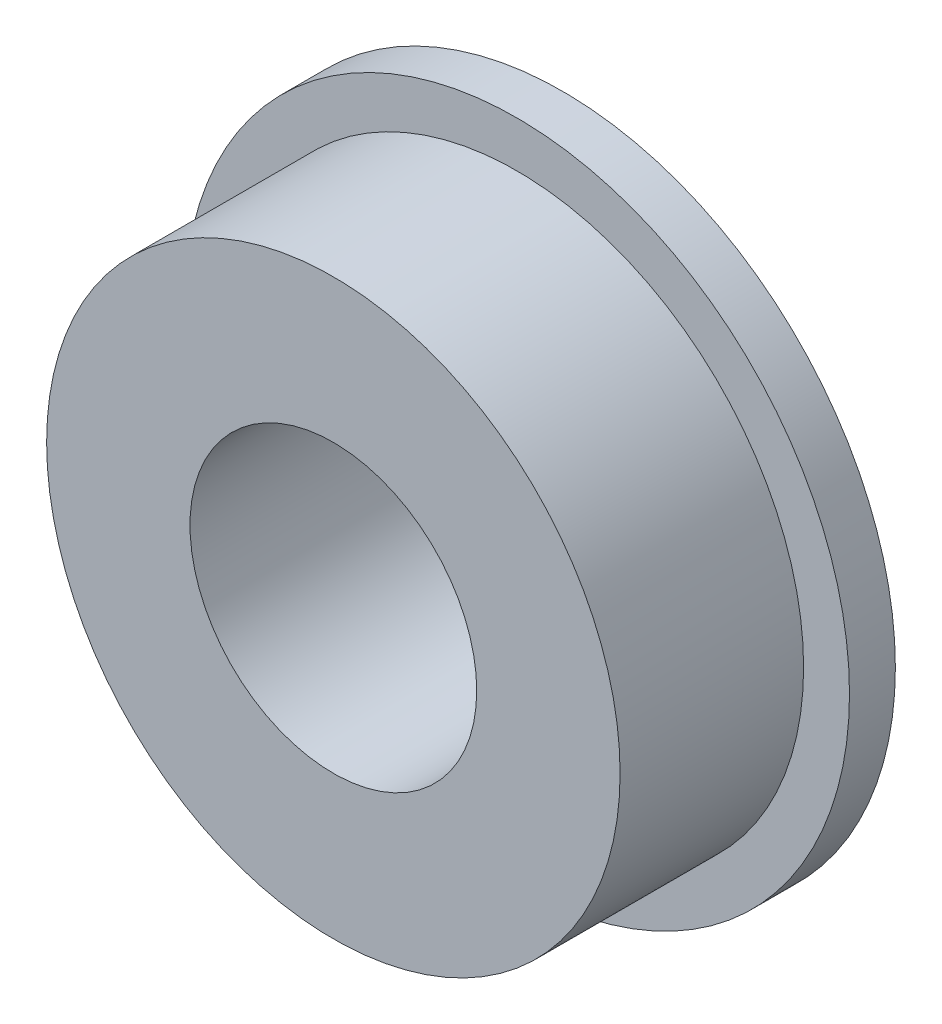
ISO-10303-21;
HEADER;
FILE_DESCRIPTION(('STEP AP214'),'2;1');
FILE_NAME('part.step','',(''),(''),'','','');
FILE_SCHEMA(('AUTOMOTIVE_DESIGN { 1 0 10303 214 1 1 1 1 }'));
ENDSEC;
DATA;
#1=APPLICATION_CONTEXT('core data for automotive mechanical design processes');
#2=APPLICATION_PROTOCOL_DEFINITION('international standard','automotive_design',2000,#1);
#3=PRODUCT_CONTEXT('',#1,'mechanical');
#4=PRODUCT('Part','Part','',(#3));
#5=PRODUCT_RELATED_PRODUCT_CATEGORY('part','',(#4));
#6=PRODUCT_DEFINITION_FORMATION('','',#4);
#7=PRODUCT_DEFINITION_CONTEXT('part definition',#1,'design');
#8=PRODUCT_DEFINITION('design','',#6,#7);
#9=PRODUCT_DEFINITION_SHAPE('','',#8);
#10=(LENGTH_UNIT() NAMED_UNIT(*) SI_UNIT(.MILLI.,.METRE.));
#11=(NAMED_UNIT(*) PLANE_ANGLE_UNIT() SI_UNIT($,.RADIAN.));
#12=(NAMED_UNIT(*) SI_UNIT($,.STERADIAN.) SOLID_ANGLE_UNIT());
#13=UNCERTAINTY_MEASURE_WITH_UNIT(LENGTH_MEASURE(1.E-05),#10,'distance_accuracy_value','');
#14=(GEOMETRIC_REPRESENTATION_CONTEXT(3) GLOBAL_UNCERTAINTY_ASSIGNED_CONTEXT((#13)) GLOBAL_UNIT_ASSIGNED_CONTEXT((#10,
#11,#12)) REPRESENTATION_CONTEXT('',''));
#15=CARTESIAN_POINT('',(0.,0.,0.));
#16=DIRECTION('',(0.,0.,1.));
#17=DIRECTION('',(1.,0.,0.));
#18=AXIS2_PLACEMENT_3D('',#15,#16,#17);
#19=CARTESIAN_POINT('',(0.,0.,4.));
#20=DIRECTION('',(0.,0.,-1.));
#21=DIRECTION('',(-1.,0.,0.));
#22=AXIS2_PLACEMENT_3D('',#19,#20,#21);
#23=CYLINDRICAL_SURFACE('',#22,2.5);
#24=CARTESIAN_POINT('',(0.,0.,4.));
#25=DIRECTION('',(0.,0.,1.));
#26=DIRECTION('',(1.,0.,0.));
#27=AXIS2_PLACEMENT_3D('',#24,#25,#26);
#28=CIRCLE('',#27,2.5);
#29=CARTESIAN_POINT('',(2.5,0.,4.));
#30=VERTEX_POINT('',#29);
#31=EDGE_CURVE('E50',#30,#30,#28,.T.);
#32=ORIENTED_EDGE('',*,*,#31,.T.);
#33=EDGE_LOOP('',(#32));
#34=FACE_BOUND('',#33,.T.);
#35=CARTESIAN_POINT('',(0.,0.,0.));
#36=DIRECTION('',(0.,0.,1.));
#37=DIRECTION('',(1.,0.,0.));
#38=AXIS2_PLACEMENT_3D('',#35,#36,#37);
#39=CIRCLE('',#38,2.5);
#40=CARTESIAN_POINT('',(2.5,0.,0.));
#41=VERTEX_POINT('',#40);
#42=EDGE_CURVE('E46',#41,#41,#39,.T.);
#43=ORIENTED_EDGE('',*,*,#42,.F.);
#44=EDGE_LOOP('',(#43));
#45=FACE_BOUND('',#44,.T.);
#46=ADVANCED_FACE('F43',(#34,#45),#23,.F.);
#47=CARTESIAN_POINT('',(0.,0.,4.));
#48=DIRECTION('',(0.,0.,-1.));
#49=DIRECTION('',(-1.,0.,0.));
#50=AXIS2_PLACEMENT_3D('',#47,#48,#49);
#51=CYLINDRICAL_SURFACE('',#50,5.);
#52=CARTESIAN_POINT('',(0.,0.,0.8));
#53=DIRECTION('',(0.,0.,1.));
#54=DIRECTION('',(1.,0.,0.));
#55=AXIS2_PLACEMENT_3D('',#52,#53,#54);
#56=CIRCLE('',#55,5.);
#57=CARTESIAN_POINT('',(5.,0.,0.8));
#58=VERTEX_POINT('',#57);
#59=EDGE_CURVE('E59',#58,#58,#56,.T.);
#60=ORIENTED_EDGE('',*,*,#59,.T.);
#61=EDGE_LOOP('',(#60));
#62=FACE_BOUND('',#61,.T.);
#63=CARTESIAN_POINT('',(0.,0.,4.));
#64=DIRECTION('',(0.,0.,1.));
#65=DIRECTION('',(1.,0.,0.));
#66=AXIS2_PLACEMENT_3D('',#63,#64,#65);
#67=CIRCLE('',#66,5.);
#68=CARTESIAN_POINT('',(5.,0.,4.));
#69=VERTEX_POINT('',#68);
#70=EDGE_CURVE('E10',#69,#69,#67,.T.);
#71=ORIENTED_EDGE('',*,*,#70,.F.);
#72=EDGE_LOOP('',(#71));
#73=FACE_BOUND('',#72,.T.);
#74=ADVANCED_FACE('F66',(#62,#73),#51,.T.);
#75=CARTESIAN_POINT('',(0.,0.,4.));
#76=DIRECTION('',(0.,0.,1.));
#77=DIRECTION('',(1.,0.,0.));
#78=AXIS2_PLACEMENT_3D('',#75,#76,#77);
#79=PLANE('',#78);
#80=ORIENTED_EDGE('',*,*,#31,.F.);
#81=EDGE_LOOP('',(#80));
#82=FACE_BOUND('',#81,.T.);
#83=ORIENTED_EDGE('',*,*,#70,.T.);
#84=EDGE_LOOP('',(#83));
#85=FACE_BOUND('',#84,.T.);
#86=ADVANCED_FACE('F83',(#82,#85),#79,.T.);
#87=CARTESIAN_POINT('',(0.,0.,0.));
#88=DIRECTION('',(0.,0.,1.));
#89=DIRECTION('',(1.,0.,0.));
#90=AXIS2_PLACEMENT_3D('',#87,#88,#89);
#91=PLANE('',#90);
#92=ORIENTED_EDGE('',*,*,#42,.T.);
#93=EDGE_LOOP('',(#92));
#94=FACE_BOUND('',#93,.T.);
#95=CARTESIAN_POINT('',(0.,0.,0.));
#96=DIRECTION('',(0.,0.,1.));
#97=DIRECTION('',(1.,0.,0.));
#98=AXIS2_PLACEMENT_3D('',#95,#96,#97);
#99=CIRCLE('',#98,5.8);
#100=CARTESIAN_POINT('',(5.8,0.,0.));
#101=VERTEX_POINT('',#100);
#102=EDGE_CURVE('E56',#101,#101,#99,.T.);
#103=ORIENTED_EDGE('',*,*,#102,.F.);
#104=EDGE_LOOP('',(#103));
#105=FACE_BOUND('',#104,.T.);
#106=ADVANCED_FACE('F78',(#94,#105),#91,.F.);
#107=CARTESIAN_POINT('',(0.,0.,0.8));
#108=DIRECTION('',(0.,0.,-1.));
#109=DIRECTION('',(-1.,0.,0.));
#110=AXIS2_PLACEMENT_3D('',#107,#108,#109);
#111=CYLINDRICAL_SURFACE('',#110,5.8);
#112=CARTESIAN_POINT('',(0.,0.,0.8));
#113=DIRECTION('',(0.,0.,1.));
#114=DIRECTION('',(1.,0.,0.));
#115=AXIS2_PLACEMENT_3D('',#112,#113,#114);
#116=CIRCLE('',#115,5.8);
#117=CARTESIAN_POINT('',(5.8,0.,0.8));
#118=VERTEX_POINT('',#117);
#119=EDGE_CURVE('E60',#118,#118,#116,.T.);
#120=ORIENTED_EDGE('',*,*,#119,.F.);
#121=EDGE_LOOP('',(#120));
#122=FACE_BOUND('',#121,.T.);
#123=ORIENTED_EDGE('',*,*,#102,.T.);
#124=EDGE_LOOP('',(#123));
#125=FACE_BOUND('',#124,.T.);
#126=ADVANCED_FACE('F72',(#122,#125),#111,.T.);
#127=CARTESIAN_POINT('',(0.,0.,0.8));
#128=DIRECTION('',(0.,0.,1.));
#129=DIRECTION('',(1.,0.,0.));
#130=AXIS2_PLACEMENT_3D('',#127,#128,#129);
#131=PLANE('',#130);
#132=ORIENTED_EDGE('',*,*,#59,.F.);
#133=EDGE_LOOP('',(#132));
#134=FACE_BOUND('',#133,.T.);
#135=ORIENTED_EDGE('',*,*,#119,.T.);
#136=EDGE_LOOP('',(#135));
#137=FACE_BOUND('',#136,.T.);
#138=ADVANCED_FACE('F69',(#134,#137),#131,.T.);
#139=CLOSED_SHELL('',(#46,#74,#86,#106,#126,#138));
#140=MANIFOLD_SOLID_BREP('B2',#139);
#141=ADVANCED_BREP_SHAPE_REPRESENTATION('',(#18,#140),#14);
#142=SHAPE_DEFINITION_REPRESENTATION(#9,#141);
ENDSEC;
END-ISO-10303-21;
